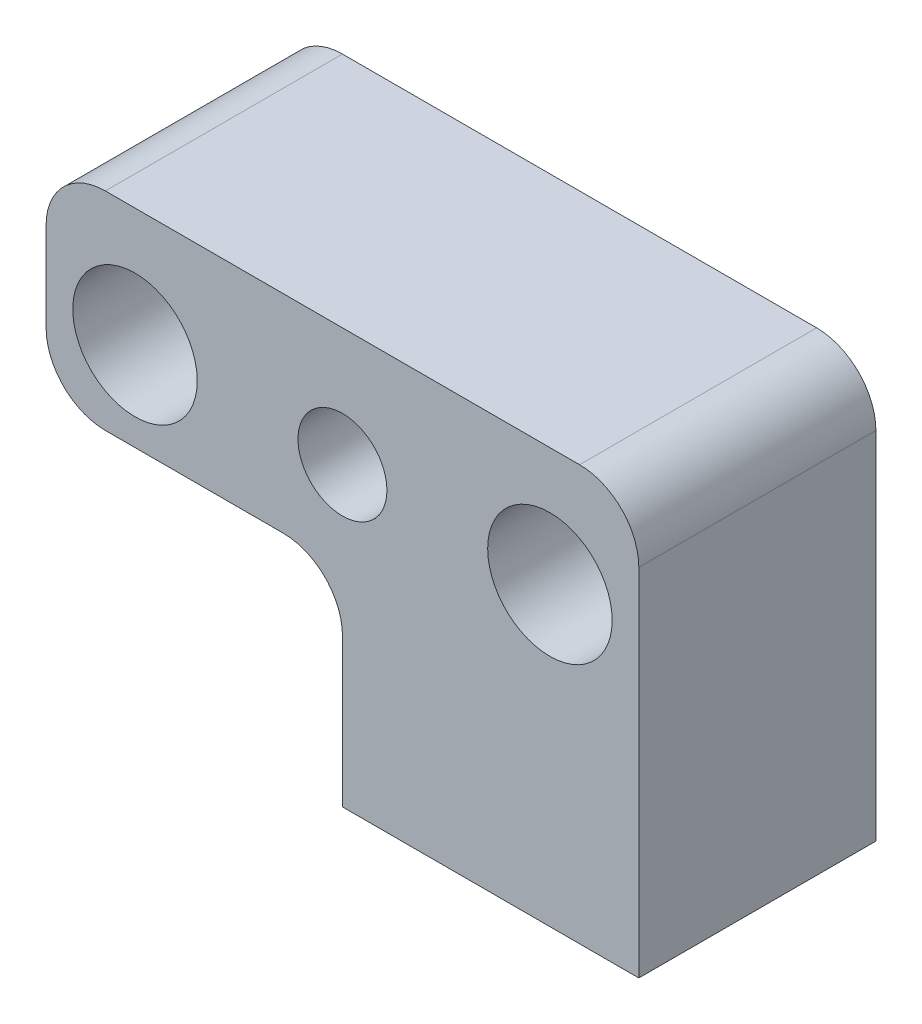
ISO-10303-21;
HEADER;
FILE_DESCRIPTION(('STEP AP214'),'2;1');
FILE_NAME('part.step','',(''),(''),'','','');
FILE_SCHEMA(('AUTOMOTIVE_DESIGN { 1 0 10303 214 1 1 1 1 }'));
ENDSEC;
DATA;
#1=APPLICATION_CONTEXT('core data for automotive mechanical design processes');
#2=APPLICATION_PROTOCOL_DEFINITION('international standard','automotive_design',2000,#1);
#3=PRODUCT_CONTEXT('',#1,'mechanical');
#4=PRODUCT('Part','Part','',(#3));
#5=PRODUCT_RELATED_PRODUCT_CATEGORY('part','',(#4));
#6=PRODUCT_DEFINITION_FORMATION('','',#4);
#7=PRODUCT_DEFINITION_CONTEXT('part definition',#1,'design');
#8=PRODUCT_DEFINITION('design','',#6,#7);
#9=PRODUCT_DEFINITION_SHAPE('','',#8);
#10=(LENGTH_UNIT() NAMED_UNIT(*) SI_UNIT(.MILLI.,.METRE.));
#11=(NAMED_UNIT(*) PLANE_ANGLE_UNIT() SI_UNIT($,.RADIAN.));
#12=(NAMED_UNIT(*) SI_UNIT($,.STERADIAN.) SOLID_ANGLE_UNIT());
#13=UNCERTAINTY_MEASURE_WITH_UNIT(LENGTH_MEASURE(1.E-05),#10,'distance_accuracy_value','');
#14=(GEOMETRIC_REPRESENTATION_CONTEXT(3) GLOBAL_UNCERTAINTY_ASSIGNED_CONTEXT((#13)) GLOBAL_UNIT_ASSIGNED_CONTEXT((#10,
#11,#12)) REPRESENTATION_CONTEXT('',''));
#15=CARTESIAN_POINT('',(0.,0.,0.));
#16=DIRECTION('',(0.,0.,1.));
#17=DIRECTION('',(1.,0.,0.));
#18=AXIS2_PLACEMENT_3D('',#15,#16,#17);
#19=CARTESIAN_POINT('',(50.,-40.,40.));
#20=DIRECTION('',(0.,1.,0.));
#21=DIRECTION('',(-1.,0.,0.));
#22=AXIS2_PLACEMENT_3D('',#19,#20,#21);
#23=PLANE('',#22);
#24=DIRECTION('',(-1.,0.,0.));
#25=VECTOR('',#24,1.);
#26=CARTESIAN_POINT('',(45.,-40.,35.));
#27=LINE('',#26,#25);
#28=CARTESIAN_POINT('',(45.,-40.,35.));
#29=VERTEX_POINT('',#28);
#30=CARTESIAN_POINT('',(5.,-40.,35.));
#31=VERTEX_POINT('',#30);
#32=EDGE_CURVE('E143',#29,#31,#27,.T.);
#33=ORIENTED_EDGE('',*,*,#32,.T.);
#34=DIRECTION('',(0.,0.,-1.));
#35=VECTOR('',#34,1.);
#36=CARTESIAN_POINT('',(5.,-40.,5.));
#37=LINE('',#36,#35);
#38=CARTESIAN_POINT('',(5.,-40.,5.));
#39=VERTEX_POINT('',#38);
#40=EDGE_CURVE('E162',#31,#39,#37,.T.);
#41=ORIENTED_EDGE('',*,*,#40,.T.);
#42=DIRECTION('',(1.,0.,0.));
#43=VECTOR('',#42,1.);
#44=CARTESIAN_POINT('',(45.,-40.,5.));
#45=LINE('',#44,#43);
#46=CARTESIAN_POINT('',(45.,-40.,5.));
#47=VERTEX_POINT('',#46);
#48=EDGE_CURVE('E149',#39,#47,#45,.T.);
#49=ORIENTED_EDGE('',*,*,#48,.T.);
#50=DIRECTION('',(0.,0.,1.));
#51=VECTOR('',#50,1.);
#52=CARTESIAN_POINT('',(45.,-40.,5.));
#53=LINE('',#52,#51);
#54=EDGE_CURVE('E165',#47,#29,#53,.T.);
#55=ORIENTED_EDGE('',*,*,#54,.T.);
#56=EDGE_LOOP('',(#33,#41,#49,#55));
#57=FACE_BOUND('',#56,.T.);
#58=CARTESIAN_POINT('',(16.,-40.,20.));
#59=DIRECTION('',(0.,1.,0.));
#60=DIRECTION('',(-1.,0.,0.));
#61=AXIS2_PLACEMENT_3D('',#58,#59,#60);
#62=CIRCLE('',#61,3.);
#63=CARTESIAN_POINT('',(13.,-40.,20.));
#64=VERTEX_POINT('',#63);
#65=EDGE_CURVE('E204',#64,#64,#62,.F.);
#66=ORIENTED_EDGE('',*,*,#65,.F.);
#67=EDGE_LOOP('',(#66));
#68=FACE_BOUND('',#67,.T.);
#69=CARTESIAN_POINT('',(36.,-40.,20.));
#70=DIRECTION('',(0.,1.,0.));
#71=DIRECTION('',(-1.,0.,0.));
#72=AXIS2_PLACEMENT_3D('',#69,#70,#71);
#73=CIRCLE('',#72,3.);
#74=CARTESIAN_POINT('',(33.,-40.,20.));
#75=VERTEX_POINT('',#74);
#76=EDGE_CURVE('E197',#75,#75,#73,.F.);
#77=ORIENTED_EDGE('',*,*,#76,.F.);
#78=EDGE_LOOP('',(#77));
#79=FACE_BOUND('',#78,.T.);
#80=ADVANCED_FACE('F33',(#57,#68,#79),#23,.F.);
#81=CARTESIAN_POINT('',(36.,-90.,20.));
#82=DIRECTION('',(0.,1.,0.));
#83=DIRECTION('',(-1.,0.,0.));
#84=AXIS2_PLACEMENT_3D('',#81,#82,#83);
#85=CYLINDRICAL_SURFACE('',#84,3.);
#86=CARTESIAN_POINT('',(36.,-15.,20.));
#87=DIRECTION('',(0.,-1.,0.));
#88=DIRECTION('',(-1.,0.,0.));
#89=AXIS2_PLACEMENT_3D('',#86,#87,#88);
#90=CIRCLE('',#89,3.);
#91=CARTESIAN_POINT('',(33.,-15.,20.));
#92=VERTEX_POINT('',#91);
#93=EDGE_CURVE('E193',#92,#92,#90,.T.);
#94=ORIENTED_EDGE('',*,*,#93,.F.);
#95=EDGE_LOOP('',(#94));
#96=FACE_BOUND('',#95,.T.);
#97=ORIENTED_EDGE('',*,*,#76,.T.);
#98=EDGE_LOOP('',(#97));
#99=FACE_BOUND('',#98,.T.);
#100=ADVANCED_FACE('F326',(#96,#99),#85,.F.);
#101=CARTESIAN_POINT('',(36.,-15.,20.));
#102=DIRECTION('',(0.,1.,0.));
#103=DIRECTION('',(-1.,0.,0.));
#104=AXIS2_PLACEMENT_3D('',#101,#102,#103);
#105=PLANE('',#104);
#106=ORIENTED_EDGE('',*,*,#93,.T.);
#107=EDGE_LOOP('',(#106));
#108=FACE_BOUND('',#107,.T.);
#109=ADVANCED_FACE('F331',(#108),#105,.F.);
#110=CARTESIAN_POINT('',(16.,-90.,20.));
#111=DIRECTION('',(0.,1.,0.));
#112=DIRECTION('',(-1.,0.,0.));
#113=AXIS2_PLACEMENT_3D('',#110,#111,#112);
#114=CYLINDRICAL_SURFACE('',#113,3.);
#115=CARTESIAN_POINT('',(16.,-15.,20.));
#116=DIRECTION('',(0.,-1.,0.));
#117=DIRECTION('',(-1.,0.,0.));
#118=AXIS2_PLACEMENT_3D('',#115,#116,#117);
#119=CIRCLE('',#118,3.);
#120=CARTESIAN_POINT('',(13.,-15.,20.));
#121=VERTEX_POINT('',#120);
#122=EDGE_CURVE('E194',#121,#121,#119,.T.);
#123=ORIENTED_EDGE('',*,*,#122,.F.);
#124=EDGE_LOOP('',(#123));
#125=FACE_BOUND('',#124,.T.);
#126=ORIENTED_EDGE('',*,*,#65,.T.);
#127=EDGE_LOOP('',(#126));
#128=FACE_BOUND('',#127,.T.);
#129=ADVANCED_FACE('F368',(#125,#128),#114,.F.);
#130=CARTESIAN_POINT('',(16.,-15.,20.));
#131=DIRECTION('',(0.,1.,0.));
#132=DIRECTION('',(-1.,0.,0.));
#133=AXIS2_PLACEMENT_3D('',#130,#131,#132);
#134=PLANE('',#133);
#135=ORIENTED_EDGE('',*,*,#122,.T.);
#136=EDGE_LOOP('',(#135));
#137=FACE_BOUND('',#136,.T.);
#138=ADVANCED_FACE('F361',(#137),#134,.F.);
#139=CARTESIAN_POINT('',(0.,-50.,0.));
#140=DIRECTION('',(0.,-1.,0.));
#141=DIRECTION('',(1.,0.,0.));
#142=AXIS2_PLACEMENT_3D('',#139,#140,#141);
#143=PLANE('',#142);
#144=DIRECTION('',(0.,0.,-1.));
#145=VECTOR('',#144,1.);
#146=CARTESIAN_POINT('',(0.,-50.,0.));
#147=LINE('',#146,#145);
#148=CARTESIAN_POINT('',(0.,-50.,40.));
#149=VERTEX_POINT('',#148);
#150=CARTESIAN_POINT('',(0.,-50.,0.));
#151=VERTEX_POINT('',#150);
#152=EDGE_CURVE('E150',#149,#151,#147,.T.);
#153=ORIENTED_EDGE('',*,*,#152,.T.);
#154=DIRECTION('',(1.,0.,0.));
#155=VECTOR('',#154,1.);
#156=CARTESIAN_POINT('',(50.,-50.,0.));
#157=LINE('',#156,#155);
#158=CARTESIAN_POINT('',(50.,-50.,0.));
#159=VERTEX_POINT('',#158);
#160=EDGE_CURVE('E176',#151,#159,#157,.T.);
#161=ORIENTED_EDGE('',*,*,#160,.T.);
#162=DIRECTION('',(0.,0.,1.));
#163=VECTOR('',#162,1.);
#164=CARTESIAN_POINT('',(50.,-50.,0.));
#165=LINE('',#164,#163);
#166=CARTESIAN_POINT('',(50.,-50.,40.));
#167=VERTEX_POINT('',#166);
#168=EDGE_CURVE('E179',#159,#167,#165,.T.);
#169=ORIENTED_EDGE('',*,*,#168,.T.);
#170=DIRECTION('',(-1.,0.,0.));
#171=VECTOR('',#170,1.);
#172=CARTESIAN_POINT('',(50.,-50.,40.));
#173=LINE('',#172,#171);
#174=EDGE_CURVE('E182',#167,#149,#173,.T.);
#175=ORIENTED_EDGE('',*,*,#174,.T.);
#176=EDGE_LOOP('',(#153,#161,#169,#175));
#177=FACE_BOUND('',#176,.T.);
#178=DIRECTION('',(1.,0.,0.));
#179=VECTOR('',#178,1.);
#180=CARTESIAN_POINT('',(45.,-50.,5.));
#181=LINE('',#180,#179);
#182=CARTESIAN_POINT('',(5.,-50.,5.));
#183=VERTEX_POINT('',#182);
#184=CARTESIAN_POINT('',(45.,-50.,5.));
#185=VERTEX_POINT('',#184);
#186=EDGE_CURVE('E142',#183,#185,#181,.T.);
#187=ORIENTED_EDGE('',*,*,#186,.F.);
#188=DIRECTION('',(0.,0.,-1.));
#189=VECTOR('',#188,1.);
#190=CARTESIAN_POINT('',(5.,-50.,5.));
#191=LINE('',#190,#189);
#192=CARTESIAN_POINT('',(5.,-50.,35.));
#193=VERTEX_POINT('',#192);
#194=EDGE_CURVE('E134',#193,#183,#191,.T.);
#195=ORIENTED_EDGE('',*,*,#194,.F.);
#196=DIRECTION('',(-1.,0.,0.));
#197=VECTOR('',#196,1.);
#198=CARTESIAN_POINT('',(45.,-50.,35.));
#199=LINE('',#198,#197);
#200=CARTESIAN_POINT('',(45.,-50.,35.));
#201=VERTEX_POINT('',#200);
#202=EDGE_CURVE('E158',#201,#193,#199,.T.);
#203=ORIENTED_EDGE('',*,*,#202,.F.);
#204=DIRECTION('',(0.,0.,1.));
#205=VECTOR('',#204,1.);
#206=CARTESIAN_POINT('',(45.,-50.,5.));
#207=LINE('',#206,#205);
#208=EDGE_CURVE('E156',#185,#201,#207,.T.);
#209=ORIENTED_EDGE('',*,*,#208,.F.);
#210=EDGE_LOOP('',(#187,#195,#203,#209));
#211=FACE_BOUND('',#210,.T.);
#212=ADVANCED_FACE('F154',(#177,#211),#143,.T.);
#213=CARTESIAN_POINT('',(5.,-50.,5.));
#214=DIRECTION('',(1.,0.,0.));
#215=DIRECTION('',(0.,1.,0.));
#216=AXIS2_PLACEMENT_3D('',#213,#214,#215);
#217=PLANE('',#216);
#218=ORIENTED_EDGE('',*,*,#40,.F.);
#219=DIRECTION('',(0.,1.,0.));
#220=VECTOR('',#219,1.);
#221=CARTESIAN_POINT('',(5.,-50.,35.));
#222=LINE('',#221,#220);
#223=EDGE_CURVE('E48',#193,#31,#222,.T.);
#224=ORIENTED_EDGE('',*,*,#223,.F.);
#225=ORIENTED_EDGE('',*,*,#194,.T.);
#226=DIRECTION('',(0.,1.,0.));
#227=VECTOR('',#226,1.);
#228=CARTESIAN_POINT('',(5.,-50.,5.));
#229=LINE('',#228,#227);
#230=EDGE_CURVE('E137',#183,#39,#229,.T.);
#231=ORIENTED_EDGE('',*,*,#230,.T.);
#232=EDGE_LOOP('',(#218,#224,#225,#231));
#233=FACE_BOUND('',#232,.T.);
#234=ADVANCED_FACE('F136',(#233),#217,.T.);
#235=CARTESIAN_POINT('',(45.,-50.,5.));
#236=DIRECTION('',(0.,0.,1.));
#237=DIRECTION('',(1.,0.,0.));
#238=AXIS2_PLACEMENT_3D('',#235,#236,#237);
#239=PLANE('',#238);
#240=ORIENTED_EDGE('',*,*,#48,.F.);
#241=ORIENTED_EDGE('',*,*,#230,.F.);
#242=ORIENTED_EDGE('',*,*,#186,.T.);
#243=DIRECTION('',(0.,1.,0.));
#244=VECTOR('',#243,1.);
#245=CARTESIAN_POINT('',(45.,-50.,5.));
#246=LINE('',#245,#244);
#247=EDGE_CURVE('E151',#185,#47,#246,.T.);
#248=ORIENTED_EDGE('',*,*,#247,.T.);
#249=EDGE_LOOP('',(#240,#241,#242,#248));
#250=FACE_BOUND('',#249,.T.);
#251=ADVANCED_FACE('F146',(#250),#239,.T.);
#252=CARTESIAN_POINT('',(45.,-50.,5.));
#253=DIRECTION('',(-1.,0.,0.));
#254=DIRECTION('',(0.,-1.,0.));
#255=AXIS2_PLACEMENT_3D('',#252,#253,#254);
#256=PLANE('',#255);
#257=ORIENTED_EDGE('',*,*,#54,.F.);
#258=ORIENTED_EDGE('',*,*,#247,.F.);
#259=ORIENTED_EDGE('',*,*,#208,.T.);
#260=DIRECTION('',(0.,1.,0.));
#261=VECTOR('',#260,1.);
#262=CARTESIAN_POINT('',(45.,-50.,35.));
#263=LINE('',#262,#261);
#264=EDGE_CURVE('E171',#201,#29,#263,.T.);
#265=ORIENTED_EDGE('',*,*,#264,.T.);
#266=EDGE_LOOP('',(#257,#258,#259,#265));
#267=FACE_BOUND('',#266,.T.);
#268=ADVANCED_FACE('F347',(#267),#256,.T.);
#269=CARTESIAN_POINT('',(45.,-50.,35.));
#270=DIRECTION('',(0.,0.,-1.));
#271=DIRECTION('',(-1.,0.,0.));
#272=AXIS2_PLACEMENT_3D('',#269,#270,#271);
#273=PLANE('',#272);
#274=ORIENTED_EDGE('',*,*,#32,.F.);
#275=ORIENTED_EDGE('',*,*,#264,.F.);
#276=ORIENTED_EDGE('',*,*,#202,.T.);
#277=ORIENTED_EDGE('',*,*,#223,.T.);
#278=EDGE_LOOP('',(#274,#275,#276,#277));
#279=FACE_BOUND('',#278,.T.);
#280=ADVANCED_FACE('F343',(#279),#273,.T.);
#281=CARTESIAN_POINT('',(-40.,9.99999999999999,40.));
#282=DIRECTION('',(0.,0.,-1.));
#283=DIRECTION('',(-1.,0.,0.));
#284=AXIS2_PLACEMENT_3D('',#281,#282,#283);
#285=CYLINDRICAL_SURFACE('',#284,10.);
#286=DIRECTION('',(0.,0.,-1.));
#287=VECTOR('',#286,1.);
#288=CARTESIAN_POINT('',(-50.,9.99999999999999,40.));
#289=LINE('',#288,#287);
#290=CARTESIAN_POINT('',(-50.,9.99999999999999,40.));
#291=VERTEX_POINT('',#290);
#292=CARTESIAN_POINT('',(-50.,9.99999999999999,0.));
#293=VERTEX_POINT('',#292);
#294=EDGE_CURVE('E260',#291,#293,#289,.T.);
#295=ORIENTED_EDGE('',*,*,#294,.F.);
#296=CARTESIAN_POINT('',(-40.,9.99999999999999,40.));
#297=DIRECTION('',(0.,0.,1.));
#298=DIRECTION('',(1.,0.,0.));
#299=AXIS2_PLACEMENT_3D('',#296,#297,#298);
#300=CIRCLE('',#299,10.);
#301=CARTESIAN_POINT('',(-40.,20.,40.));
#302=VERTEX_POINT('',#301);
#303=EDGE_CURVE('E266',#302,#291,#300,.T.);
#304=ORIENTED_EDGE('',*,*,#303,.F.);
#305=DIRECTION('',(0.,0.,-1.));
#306=VECTOR('',#305,1.);
#307=CARTESIAN_POINT('',(-40.,20.,-0.001000000000001));
#308=LINE('',#307,#306);
#309=CARTESIAN_POINT('',(-40.,20.,0.));
#310=VERTEX_POINT('',#309);
#311=EDGE_CURVE('E263',#310,#302,#308,.F.);
#312=ORIENTED_EDGE('',*,*,#311,.F.);
#313=CARTESIAN_POINT('',(-40.,9.99999999999999,0.));
#314=DIRECTION('',(0.,0.,1.));
#315=DIRECTION('',(1.,0.,0.));
#316=AXIS2_PLACEMENT_3D('',#313,#314,#315);
#317=CIRCLE('',#316,10.);
#318=EDGE_CURVE('E268',#293,#310,#317,.F.);
#319=ORIENTED_EDGE('',*,*,#318,.F.);
#320=EDGE_LOOP('',(#295,#304,#312,#319));
#321=FACE_BOUND('',#320,.T.);
#322=ADVANCED_FACE('F286',(#321),#285,.T.);
#323=CARTESIAN_POINT('',(-50.,-40.,40.));
#324=DIRECTION('',(1.,0.,0.));
#325=DIRECTION('',(0.,0.,-1.));
#326=AXIS2_PLACEMENT_3D('',#323,#324,#325);
#327=PLANE('',#326);
#328=DIRECTION('',(0.,-1.,0.));
#329=VECTOR('',#328,1.);
#330=CARTESIAN_POINT('',(-50.,-40.,40.));
#331=LINE('',#330,#329);
#332=CARTESIAN_POINT('',(-50.,-5.,40.));
#333=VERTEX_POINT('',#332);
#334=EDGE_CURVE('E225',#291,#333,#331,.T.);
#335=ORIENTED_EDGE('',*,*,#334,.F.);
#336=ORIENTED_EDGE('',*,*,#294,.T.);
#337=DIRECTION('',(0.,-1.,0.));
#338=VECTOR('',#337,1.);
#339=CARTESIAN_POINT('',(-50.,-40.,0.));
#340=LINE('',#339,#338);
#341=CARTESIAN_POINT('',(-50.,-5.,0.));
#342=VERTEX_POINT('',#341);
#343=EDGE_CURVE('E224',#293,#342,#340,.T.);
#344=ORIENTED_EDGE('',*,*,#343,.T.);
#345=DIRECTION('',(0.,0.,-1.));
#346=VECTOR('',#345,1.);
#347=CARTESIAN_POINT('',(-50.,-5.,40.));
#348=LINE('',#347,#346);
#349=EDGE_CURVE('E252',#342,#333,#348,.F.);
#350=ORIENTED_EDGE('',*,*,#349,.T.);
#351=EDGE_LOOP('',(#335,#336,#344,#350));
#352=FACE_BOUND('',#351,.T.);
#353=ADVANCED_FACE('F295',(#352),#327,.F.);
#354=CARTESIAN_POINT('',(-40.,-5.00000000000001,40.001));
#355=DIRECTION('',(0.,0.,-1.));
#356=DIRECTION('',(-1.,0.,0.));
#357=AXIS2_PLACEMENT_3D('',#354,#355,#356);
#358=CYLINDRICAL_SURFACE('',#357,10.);
#359=DIRECTION('',(0.,0.,-1.));
#360=VECTOR('',#359,1.);
#361=CARTESIAN_POINT('',(-40.,-15.,40.001));
#362=LINE('',#361,#360);
#363=CARTESIAN_POINT('',(-40.,-15.,40.));
#364=VERTEX_POINT('',#363);
#365=CARTESIAN_POINT('',(-40.,-15.,0.));
#366=VERTEX_POINT('',#365);
#367=EDGE_CURVE('E249',#364,#366,#362,.T.);
#368=ORIENTED_EDGE('',*,*,#367,.F.);
#369=CARTESIAN_POINT('',(-40.,-5.00000000000001,40.));
#370=DIRECTION('',(0.,0.,1.));
#371=DIRECTION('',(1.,0.,0.));
#372=AXIS2_PLACEMENT_3D('',#369,#370,#371);
#373=CIRCLE('',#372,10.);
#374=EDGE_CURVE('E255',#333,#364,#373,.T.);
#375=ORIENTED_EDGE('',*,*,#374,.F.);
#376=ORIENTED_EDGE('',*,*,#349,.F.);
#377=CARTESIAN_POINT('',(-40.,-5.00000000000001,0.));
#378=DIRECTION('',(0.,0.,1.));
#379=DIRECTION('',(1.,0.,0.));
#380=AXIS2_PLACEMENT_3D('',#377,#378,#379);
#381=CIRCLE('',#380,10.);
#382=EDGE_CURVE('E257',#366,#342,#381,.F.);
#383=ORIENTED_EDGE('',*,*,#382,.F.);
#384=EDGE_LOOP('',(#368,#375,#376,#383));
#385=FACE_BOUND('',#384,.T.);
#386=ADVANCED_FACE('F293',(#385),#358,.T.);
#387=CARTESIAN_POINT('',(-50.,-15.,40.001));
#388=DIRECTION('',(0.,1.,0.));
#389=DIRECTION('',(-1.,0.,0.));
#390=AXIS2_PLACEMENT_3D('',#387,#388,#389);
#391=PLANE('',#390);
#392=DIRECTION('',(1.,0.,0.));
#393=VECTOR('',#392,1.);
#394=CARTESIAN_POINT('',(-50.,-15.,40.));
#395=LINE('',#394,#393);
#396=CARTESIAN_POINT('',(-9.99999999999999,-15.,40.));
#397=VERTEX_POINT('',#396);
#398=EDGE_CURVE('E191',#364,#397,#395,.T.);
#399=ORIENTED_EDGE('',*,*,#398,.F.);
#400=ORIENTED_EDGE('',*,*,#367,.T.);
#401=DIRECTION('',(1.,0.,0.));
#402=VECTOR('',#401,1.);
#403=CARTESIAN_POINT('',(-50.,-15.,0.));
#404=LINE('',#403,#402);
#405=CARTESIAN_POINT('',(-9.99999999999999,-15.,0.));
#406=VERTEX_POINT('',#405);
#407=EDGE_CURVE('E187',#366,#406,#404,.T.);
#408=ORIENTED_EDGE('',*,*,#407,.T.);
#409=DIRECTION('',(0.,0.,1.));
#410=VECTOR('',#409,1.);
#411=CARTESIAN_POINT('',(-10.,-15.,40.001));
#412=LINE('',#411,#410);
#413=EDGE_CURVE('E231',#406,#397,#412,.T.);
#414=ORIENTED_EDGE('',*,*,#413,.T.);
#415=EDGE_LOOP('',(#399,#400,#408,#414));
#416=FACE_BOUND('',#415,.T.);
#417=ADVANCED_FACE('F302',(#416),#391,.F.);
#418=CARTESIAN_POINT('',(40.,9.99999999999999,-0.001000000000001));
#419=DIRECTION('',(0.,0.,-1.));
#420=DIRECTION('',(-1.,0.,0.));
#421=AXIS2_PLACEMENT_3D('',#418,#419,#420);
#422=CYLINDRICAL_SURFACE('',#421,10.);
#423=DIRECTION('',(0.,0.,-1.));
#424=VECTOR('',#423,1.);
#425=CARTESIAN_POINT('',(40.,20.,-0.001000000000001));
#426=LINE('',#425,#424);
#427=CARTESIAN_POINT('',(40.,20.,40.));
#428=VERTEX_POINT('',#427);
#429=CARTESIAN_POINT('',(40.,20.,0.));
#430=VERTEX_POINT('',#429);
#431=EDGE_CURVE('E271',#428,#430,#426,.T.);
#432=ORIENTED_EDGE('',*,*,#431,.F.);
#433=CARTESIAN_POINT('',(40.,9.99999999999999,40.));
#434=DIRECTION('',(0.,0.,1.));
#435=DIRECTION('',(1.,0.,0.));
#436=AXIS2_PLACEMENT_3D('',#433,#434,#435);
#437=CIRCLE('',#436,10.);
#438=CARTESIAN_POINT('',(50.,9.99999999999999,40.));
#439=VERTEX_POINT('',#438);
#440=EDGE_CURVE('E41',#439,#428,#437,.T.);
#441=ORIENTED_EDGE('',*,*,#440,.F.);
#442=DIRECTION('',(0.,0.,-1.));
#443=VECTOR('',#442,1.);
#444=CARTESIAN_POINT('',(50.,9.99999999999999,40.));
#445=LINE('',#444,#443);
#446=CARTESIAN_POINT('',(50.,9.99999999999999,0.));
#447=VERTEX_POINT('',#446);
#448=EDGE_CURVE('E274',#447,#439,#445,.F.);
#449=ORIENTED_EDGE('',*,*,#448,.F.);
#450=CARTESIAN_POINT('',(40.,9.99999999999999,0.));
#451=DIRECTION('',(0.,0.,1.));
#452=DIRECTION('',(1.,0.,0.));
#453=AXIS2_PLACEMENT_3D('',#450,#451,#452);
#454=CIRCLE('',#453,10.);
#455=EDGE_CURVE('E11',#430,#447,#454,.F.);
#456=ORIENTED_EDGE('',*,*,#455,.F.);
#457=EDGE_LOOP('',(#432,#441,#449,#456));
#458=FACE_BOUND('',#457,.T.);
#459=ADVANCED_FACE('F35',(#458),#422,.T.);
#460=CARTESIAN_POINT('',(-50.,20.,-0.001000000000001));
#461=DIRECTION('',(0.,-1.,0.));
#462=DIRECTION('',(1.,0.,0.));
#463=AXIS2_PLACEMENT_3D('',#460,#461,#462);
#464=PLANE('',#463);
#465=DIRECTION('',(1.,0.,0.));
#466=VECTOR('',#465,1.);
#467=CARTESIAN_POINT('',(-50.,20.,40.));
#468=LINE('',#467,#466);
#469=EDGE_CURVE('E200',#302,#428,#468,.T.);
#470=ORIENTED_EDGE('',*,*,#469,.T.);
#471=ORIENTED_EDGE('',*,*,#431,.T.);
#472=DIRECTION('',(-1.,0.,0.));
#473=VECTOR('',#472,1.);
#474=CARTESIAN_POINT('',(-50.,20.,0.));
#475=LINE('',#474,#473);
#476=EDGE_CURVE('E203',#430,#310,#475,.T.);
#477=ORIENTED_EDGE('',*,*,#476,.T.);
#478=ORIENTED_EDGE('',*,*,#311,.T.);
#479=EDGE_LOOP('',(#470,#471,#477,#478));
#480=FACE_BOUND('',#479,.T.);
#481=ADVANCED_FACE('F282',(#480),#464,.F.);
#482=CARTESIAN_POINT('',(0.,0.,-0.001000000000001));
#483=DIRECTION('',(0.,0.,1.));
#484=DIRECTION('',(1.,0.,0.));
#485=AXIS2_PLACEMENT_3D('',#482,#483,#484);
#486=CYLINDRICAL_SURFACE('',#485,7.5);
#487=CARTESIAN_POINT('',(0.,0.,40.));
#488=DIRECTION('',(0.,0.,1.));
#489=DIRECTION('',(1.,0.,0.));
#490=AXIS2_PLACEMENT_3D('',#487,#488,#489);
#491=CIRCLE('',#490,7.5);
#492=CARTESIAN_POINT('',(7.5,0.,40.));
#493=VERTEX_POINT('',#492);
#494=EDGE_CURVE('E214',#493,#493,#491,.T.);
#495=ORIENTED_EDGE('',*,*,#494,.T.);
#496=EDGE_LOOP('',(#495));
#497=FACE_BOUND('',#496,.T.);
#498=CARTESIAN_POINT('',(0.,0.,0.));
#499=DIRECTION('',(0.,0.,1.));
#500=DIRECTION('',(1.,0.,0.));
#501=AXIS2_PLACEMENT_3D('',#498,#499,#500);
#502=CIRCLE('',#501,7.5);
#503=CARTESIAN_POINT('',(7.5,0.,0.));
#504=VERTEX_POINT('',#503);
#505=EDGE_CURVE('E221',#504,#504,#502,.F.);
#506=ORIENTED_EDGE('',*,*,#505,.T.);
#507=EDGE_LOOP('',(#506));
#508=FACE_BOUND('',#507,.T.);
#509=ADVANCED_FACE('F378',(#497,#508),#486,.F.);
#510=CARTESIAN_POINT('',(-35.,0.,-0.001000000000001));
#511=DIRECTION('',(0.,0.,1.));
#512=DIRECTION('',(1.,0.,0.));
#513=AXIS2_PLACEMENT_3D('',#510,#511,#512);
#514=CYLINDRICAL_SURFACE('',#513,10.5);
#515=CARTESIAN_POINT('',(-35.,0.,40.));
#516=DIRECTION('',(0.,0.,1.));
#517=DIRECTION('',(1.,0.,0.));
#518=AXIS2_PLACEMENT_3D('',#515,#516,#517);
#519=CIRCLE('',#518,10.5);
#520=CARTESIAN_POINT('',(-24.5,0.,40.));
#521=VERTEX_POINT('',#520);
#522=EDGE_CURVE('E207',#521,#521,#519,.T.);
#523=ORIENTED_EDGE('',*,*,#522,.T.);
#524=EDGE_LOOP('',(#523));
#525=FACE_BOUND('',#524,.T.);
#526=CARTESIAN_POINT('',(-35.,0.,0.));
#527=DIRECTION('',(0.,0.,1.));
#528=DIRECTION('',(1.,0.,0.));
#529=AXIS2_PLACEMENT_3D('',#526,#527,#528);
#530=CIRCLE('',#529,10.5);
#531=CARTESIAN_POINT('',(-24.5,0.,0.));
#532=VERTEX_POINT('',#531);
#533=EDGE_CURVE('E210',#532,#532,#530,.F.);
#534=ORIENTED_EDGE('',*,*,#533,.T.);
#535=EDGE_LOOP('',(#534));
#536=FACE_BOUND('',#535,.T.);
#537=ADVANCED_FACE('F379',(#525,#536),#514,.F.);
#538=CARTESIAN_POINT('',(35.,0.,-0.001000000000001));
#539=DIRECTION('',(0.,0.,1.));
#540=DIRECTION('',(1.,0.,0.));
#541=AXIS2_PLACEMENT_3D('',#538,#539,#540);
#542=CYLINDRICAL_SURFACE('',#541,10.5);
#543=CARTESIAN_POINT('',(35.,0.,40.));
#544=DIRECTION('',(0.,0.,1.));
#545=DIRECTION('',(-1.,0.,0.));
#546=AXIS2_PLACEMENT_3D('',#543,#544,#545);
#547=CIRCLE('',#546,10.5);
#548=CARTESIAN_POINT('',(24.5,0.,40.));
#549=VERTEX_POINT('',#548);
#550=EDGE_CURVE('E206',#549,#549,#547,.T.);
#551=ORIENTED_EDGE('',*,*,#550,.T.);
#552=EDGE_LOOP('',(#551));
#553=FACE_BOUND('',#552,.T.);
#554=CARTESIAN_POINT('',(35.,0.,0.));
#555=DIRECTION('',(0.,0.,1.));
#556=DIRECTION('',(1.,0.,0.));
#557=AXIS2_PLACEMENT_3D('',#554,#555,#556);
#558=CIRCLE('',#557,10.5);
#559=CARTESIAN_POINT('',(45.5,0.,0.));
#560=VERTEX_POINT('',#559);
#561=EDGE_CURVE('E211',#560,#560,#558,.F.);
#562=ORIENTED_EDGE('',*,*,#561,.T.);
#563=EDGE_LOOP('',(#562));
#564=FACE_BOUND('',#563,.T.);
#565=ADVANCED_FACE('F340',(#553,#564),#542,.F.);
#566=CARTESIAN_POINT('',(-10.,-25.,40.001));
#567=DIRECTION('',(0.,0.,-1.));
#568=DIRECTION('',(-1.,0.,0.));
#569=AXIS2_PLACEMENT_3D('',#566,#567,#568);
#570=CYLINDRICAL_SURFACE('',#569,10.);
#571=ORIENTED_EDGE('',*,*,#413,.F.);
#572=CARTESIAN_POINT('',(-10.,-25.,0.));
#573=DIRECTION('',(0.,0.,1.));
#574=DIRECTION('',(1.,0.,0.));
#575=AXIS2_PLACEMENT_3D('',#572,#573,#574);
#576=CIRCLE('',#575,10.);
#577=CARTESIAN_POINT('',(0.,-25.,0.));
#578=VERTEX_POINT('',#577);
#579=EDGE_CURVE('E244',#406,#578,#576,.F.);
#580=ORIENTED_EDGE('',*,*,#579,.T.);
#581=DIRECTION('',(0.,0.,1.));
#582=VECTOR('',#581,1.);
#583=CARTESIAN_POINT('',(0.,-25.,40.001));
#584=LINE('',#583,#582);
#585=CARTESIAN_POINT('',(0.,-25.,40.));
#586=VERTEX_POINT('',#585);
#587=EDGE_CURVE('E241',#586,#578,#584,.F.);
#588=ORIENTED_EDGE('',*,*,#587,.F.);
#589=CARTESIAN_POINT('',(-10.,-25.,40.));
#590=DIRECTION('',(0.,0.,1.));
#591=DIRECTION('',(1.,0.,0.));
#592=AXIS2_PLACEMENT_3D('',#589,#590,#591);
#593=CIRCLE('',#592,10.);
#594=EDGE_CURVE('E246',#586,#397,#593,.T.);
#595=ORIENTED_EDGE('',*,*,#594,.T.);
#596=EDGE_LOOP('',(#571,#580,#588,#595));
#597=FACE_BOUND('',#596,.T.);
#598=ADVANCED_FACE('F306',(#597),#570,.F.);
#599=CARTESIAN_POINT('',(0.,-40.,40.001));
#600=DIRECTION('',(1.,0.,0.));
#601=DIRECTION('',(0.,1.,0.));
#602=AXIS2_PLACEMENT_3D('',#599,#600,#601);
#603=PLANE('',#602);
#604=DIRECTION('',(0.,-1.,0.));
#605=VECTOR('',#604,1.);
#606=CARTESIAN_POINT('',(0.,-40.,40.));
#607=LINE('',#606,#605);
#608=EDGE_CURVE('E185',#586,#149,#607,.T.);
#609=ORIENTED_EDGE('',*,*,#608,.F.);
#610=ORIENTED_EDGE('',*,*,#587,.T.);
#611=DIRECTION('',(0.,-1.,0.));
#612=VECTOR('',#611,1.);
#613=CARTESIAN_POINT('',(0.,-40.,0.));
#614=LINE('',#613,#612);
#615=EDGE_CURVE('E189',#578,#151,#614,.T.);
#616=ORIENTED_EDGE('',*,*,#615,.T.);
#617=ORIENTED_EDGE('',*,*,#152,.F.);
#618=EDGE_LOOP('',(#609,#610,#616,#617));
#619=FACE_BOUND('',#618,.T.);
#620=ADVANCED_FACE('F311',(#619),#603,.F.);
#621=CARTESIAN_POINT('',(0.,0.,0.));
#622=DIRECTION('',(0.,0.,1.));
#623=DIRECTION('',(1.,0.,0.));
#624=AXIS2_PLACEMENT_3D('',#621,#622,#623);
#625=PLANE('',#624);
#626=ORIENTED_EDGE('',*,*,#561,.F.);
#627=EDGE_LOOP('',(#626));
#628=FACE_BOUND('',#627,.T.);
#629=ORIENTED_EDGE('',*,*,#533,.F.);
#630=EDGE_LOOP('',(#629));
#631=FACE_BOUND('',#630,.T.);
#632=ORIENTED_EDGE('',*,*,#505,.F.);
#633=EDGE_LOOP('',(#632));
#634=FACE_BOUND('',#633,.T.);
#635=ORIENTED_EDGE('',*,*,#476,.F.);
#636=ORIENTED_EDGE('',*,*,#455,.T.);
#637=DIRECTION('',(0.,1.,0.));
#638=VECTOR('',#637,1.);
#639=CARTESIAN_POINT('',(50.,-40.,0.));
#640=LINE('',#639,#638);
#641=EDGE_CURVE('E228',#159,#447,#640,.T.);
#642=ORIENTED_EDGE('',*,*,#641,.F.);
#643=ORIENTED_EDGE('',*,*,#160,.F.);
#644=ORIENTED_EDGE('',*,*,#615,.F.);
#645=ORIENTED_EDGE('',*,*,#579,.F.);
#646=ORIENTED_EDGE('',*,*,#407,.F.);
#647=ORIENTED_EDGE('',*,*,#382,.T.);
#648=ORIENTED_EDGE('',*,*,#343,.F.);
#649=ORIENTED_EDGE('',*,*,#318,.T.);
#650=EDGE_LOOP('',(#635,#636,#642,#643,#644,#645,#646,#647,#648,#649));
#651=FACE_BOUND('',#650,.T.);
#652=ADVANCED_FACE('F299',(#628,#631,#634,#651),#625,.F.);
#653=CARTESIAN_POINT('',(0.,0.,40.));
#654=DIRECTION('',(0.,0.,1.));
#655=DIRECTION('',(1.,0.,0.));
#656=AXIS2_PLACEMENT_3D('',#653,#654,#655);
#657=PLANE('',#656);
#658=DIRECTION('',(0.,1.,0.));
#659=VECTOR('',#658,1.);
#660=CARTESIAN_POINT('',(50.,-40.,40.));
#661=LINE('',#660,#659);
#662=EDGE_CURVE('E227',#167,#439,#661,.T.);
#663=ORIENTED_EDGE('',*,*,#662,.T.);
#664=ORIENTED_EDGE('',*,*,#440,.T.);
#665=ORIENTED_EDGE('',*,*,#469,.F.);
#666=ORIENTED_EDGE('',*,*,#303,.T.);
#667=ORIENTED_EDGE('',*,*,#334,.T.);
#668=ORIENTED_EDGE('',*,*,#374,.T.);
#669=ORIENTED_EDGE('',*,*,#398,.T.);
#670=ORIENTED_EDGE('',*,*,#594,.F.);
#671=ORIENTED_EDGE('',*,*,#608,.T.);
#672=ORIENTED_EDGE('',*,*,#174,.F.);
#673=EDGE_LOOP('',(#663,#664,#665,#666,#667,#668,#669,#670,#671,#672));
#674=FACE_BOUND('',#673,.T.);
#675=ORIENTED_EDGE('',*,*,#550,.F.);
#676=EDGE_LOOP('',(#675));
#677=FACE_BOUND('',#676,.T.);
#678=ORIENTED_EDGE('',*,*,#522,.F.);
#679=EDGE_LOOP('',(#678));
#680=FACE_BOUND('',#679,.T.);
#681=ORIENTED_EDGE('',*,*,#494,.F.);
#682=EDGE_LOOP('',(#681));
#683=FACE_BOUND('',#682,.T.);
#684=ADVANCED_FACE('F277',(#674,#677,#680,#683),#657,.T.);
#685=CARTESIAN_POINT('',(50.,-40.,40.));
#686=DIRECTION('',(-1.,0.,0.));
#687=DIRECTION('',(0.,0.,1.));
#688=AXIS2_PLACEMENT_3D('',#685,#686,#687);
#689=PLANE('',#688);
#690=ORIENTED_EDGE('',*,*,#641,.T.);
#691=ORIENTED_EDGE('',*,*,#448,.T.);
#692=ORIENTED_EDGE('',*,*,#662,.F.);
#693=ORIENTED_EDGE('',*,*,#168,.F.);
#694=EDGE_LOOP('',(#690,#691,#692,#693));
#695=FACE_BOUND('',#694,.T.);
#696=ADVANCED_FACE('F316',(#695),#689,.F.);
#697=CLOSED_SHELL('',(#80,#100,#109,#129,#138,#212,#234,#251,#268,#280,#322,#353,#386,#417,#459,
#481,#509,#537,#565,#598,#620,#652,#684,#696));
#698=MANIFOLD_SOLID_BREP('B2',#697);
#699=ADVANCED_BREP_SHAPE_REPRESENTATION('',(#18,#698),#14);
#700=SHAPE_DEFINITION_REPRESENTATION(#9,#699);
ENDSEC;
END-ISO-10303-21;
